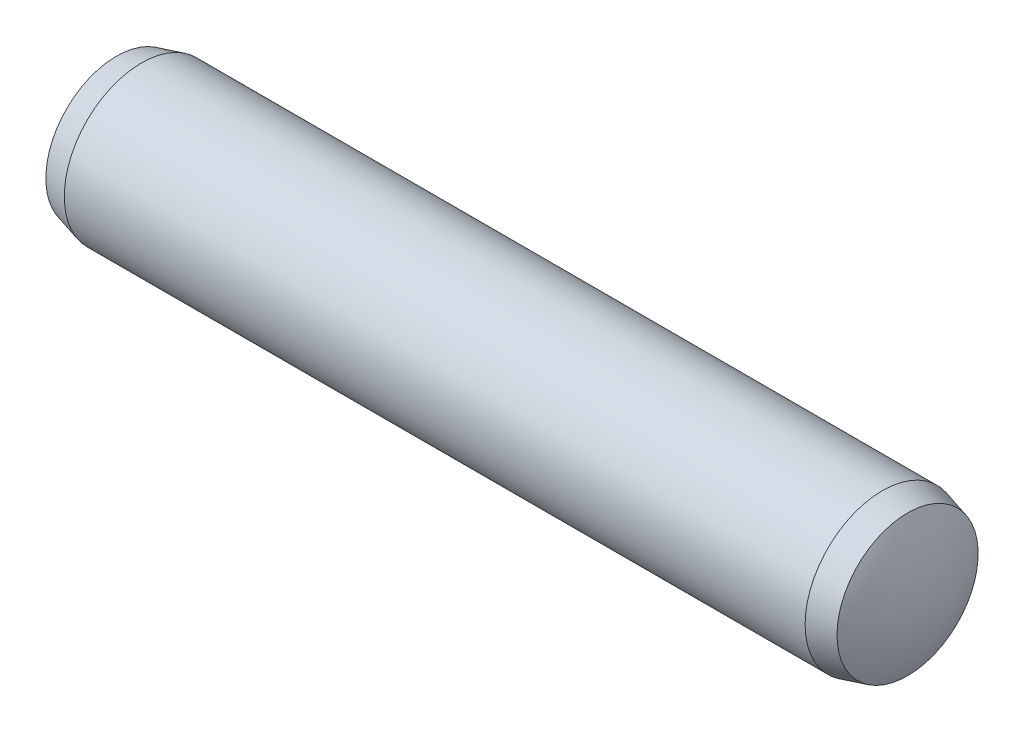
ISO-10303-21;
HEADER;
FILE_DESCRIPTION(('STEP AP214'),'2;1');
FILE_NAME('part.step','',(''),(''),'','','');
FILE_SCHEMA(('AUTOMOTIVE_DESIGN { 1 0 10303 214 1 1 1 1 }'));
ENDSEC;
DATA;
#1=APPLICATION_CONTEXT('core data for automotive mechanical design processes');
#2=APPLICATION_PROTOCOL_DEFINITION('international standard','automotive_design',2000,#1);
#3=PRODUCT_CONTEXT('',#1,'mechanical');
#4=PRODUCT('Part','Part','',(#3));
#5=PRODUCT_RELATED_PRODUCT_CATEGORY('part','',(#4));
#6=PRODUCT_DEFINITION_FORMATION('','',#4);
#7=PRODUCT_DEFINITION_CONTEXT('part definition',#1,'design');
#8=PRODUCT_DEFINITION('design','',#6,#7);
#9=PRODUCT_DEFINITION_SHAPE('','',#8);
#10=(LENGTH_UNIT() NAMED_UNIT(*) SI_UNIT(.MILLI.,.METRE.));
#11=(NAMED_UNIT(*) PLANE_ANGLE_UNIT() SI_UNIT($,.RADIAN.));
#12=(NAMED_UNIT(*) SI_UNIT($,.STERADIAN.) SOLID_ANGLE_UNIT());
#13=UNCERTAINTY_MEASURE_WITH_UNIT(LENGTH_MEASURE(1.E-05),#10,'distance_accuracy_value','');
#14=(GEOMETRIC_REPRESENTATION_CONTEXT(3) GLOBAL_UNCERTAINTY_ASSIGNED_CONTEXT((#13)) GLOBAL_UNIT_ASSIGNED_CONTEXT((#10,
#11,#12)) REPRESENTATION_CONTEXT('',''));
#15=CARTESIAN_POINT('',(0.,0.,0.));
#16=DIRECTION('',(0.,0.,1.));
#17=DIRECTION('',(1.,0.,0.));
#18=AXIS2_PLACEMENT_3D('',#15,#16,#17);
#19=CARTESIAN_POINT('',(-4.95259652750102,0.,0.));
#20=DIRECTION('',(0.,1.,0.));
#21=DIRECTION('',(-1.,0.,0.));
#22=AXIS2_PLACEMENT_3D('',#19,#20,#21);
#23=SPHERICAL_SURFACE('',#22,3.04740347249898);
#24=CARTESIAN_POINT('',(-7.67499999994925,0.,0.));
#25=DIRECTION('',(1.,0.,0.));
#26=DIRECTION('',(0.,0.,-1.));
#27=AXIS2_PLACEMENT_3D('',#24,#25,#26);
#28=CIRCLE('',#27,1.36937476867365);
#29=CARTESIAN_POINT('',(-7.67499999994925,0.,-1.36937476867365));
#30=VERTEX_POINT('',#29);
#31=EDGE_CURVE('E19',#30,#30,#28,.T.);
#32=ORIENTED_EDGE('',*,*,#31,.F.);
#33=EDGE_LOOP('',(#32));
#34=FACE_BOUND('',#33,.T.);
#35=ADVANCED_FACE('F15',(#34),#23,.T.);
#36=CARTESIAN_POINT('',(4.95259652750102,0.,0.));
#37=DIRECTION('',(0.,1.,0.));
#38=DIRECTION('',(1.,0.,0.));
#39=AXIS2_PLACEMENT_3D('',#36,#37,#38);
#40=SPHERICAL_SURFACE('',#39,3.04740347249898);
#41=CARTESIAN_POINT('',(7.67499999994925,0.,0.));
#42=DIRECTION('',(-1.,0.,0.));
#43=DIRECTION('',(0.,0.,1.));
#44=AXIS2_PLACEMENT_3D('',#41,#42,#43);
#45=CIRCLE('',#44,1.36937476867365);
#46=CARTESIAN_POINT('',(7.67499999994925,0.,1.36937476867365));
#47=VERTEX_POINT('',#46);
#48=EDGE_CURVE('E32',#47,#47,#45,.T.);
#49=ORIENTED_EDGE('',*,*,#48,.F.);
#50=EDGE_LOOP('',(#49));
#51=FACE_BOUND('',#50,.T.);
#52=ADVANCED_FACE('F37',(#51),#40,.T.);
#53=CARTESIAN_POINT('',(-7.18750000021373,0.,0.));
#54=DIRECTION('',(1.,0.,0.));
#55=DIRECTION('',(0.,0.,-1.));
#56=AXIS2_PLACEMENT_3D('',#53,#54,#55);
#57=CONICAL_SURFACE('',#56,1.49999999993611,0.26179938784347);
#58=ORIENTED_EDGE('',*,*,#31,.T.);
#59=EDGE_LOOP('',(#58));
#60=FACE_BOUND('',#59,.T.);
#61=CARTESIAN_POINT('',(-7.1875,0.,0.));
#62=DIRECTION('',(1.,0.,0.));
#63=DIRECTION('',(0.,0.,-1.));
#64=AXIS2_PLACEMENT_3D('',#61,#62,#63);
#65=CIRCLE('',#64,1.5);
#66=CARTESIAN_POINT('',(-7.1875,0.,-1.5));
#67=VERTEX_POINT('',#66);
#68=EDGE_CURVE('E24',#67,#67,#65,.T.);
#69=ORIENTED_EDGE('',*,*,#68,.F.);
#70=EDGE_LOOP('',(#69));
#71=FACE_BOUND('',#70,.T.);
#72=ADVANCED_FACE('F40',(#60,#71),#57,.T.);
#73=CARTESIAN_POINT('',(7.18750000021373,0.,0.));
#74=DIRECTION('',(-1.,0.,0.));
#75=DIRECTION('',(0.,0.,1.));
#76=AXIS2_PLACEMENT_3D('',#73,#74,#75);
#77=CONICAL_SURFACE('',#76,1.49999999993611,0.26179938784347);
#78=CARTESIAN_POINT('',(7.1875,0.,0.));
#79=DIRECTION('',(1.,0.,0.));
#80=DIRECTION('',(0.,0.,-1.));
#81=AXIS2_PLACEMENT_3D('',#78,#79,#80);
#82=CIRCLE('',#81,1.5);
#83=CARTESIAN_POINT('',(7.1875,0.,-1.5));
#84=VERTEX_POINT('',#83);
#85=EDGE_CURVE('E10',#84,#84,#82,.F.);
#86=ORIENTED_EDGE('',*,*,#85,.F.);
#87=EDGE_LOOP('',(#86));
#88=FACE_BOUND('',#87,.T.);
#89=ORIENTED_EDGE('',*,*,#48,.T.);
#90=EDGE_LOOP('',(#89));
#91=FACE_BOUND('',#90,.T.);
#92=ADVANCED_FACE('F44',(#88,#91),#77,.T.);
#93=CARTESIAN_POINT('',(-8.,0.,0.));
#94=DIRECTION('',(1.,0.,0.));
#95=DIRECTION('',(0.,0.,-1.));
#96=AXIS2_PLACEMENT_3D('',#93,#94,#95);
#97=CYLINDRICAL_SURFACE('',#96,1.5);
#98=ORIENTED_EDGE('',*,*,#85,.T.);
#99=EDGE_LOOP('',(#98));
#100=FACE_BOUND('',#99,.T.);
#101=ORIENTED_EDGE('',*,*,#68,.T.);
#102=EDGE_LOOP('',(#101));
#103=FACE_BOUND('',#102,.T.);
#104=ADVANCED_FACE('F48',(#100,#103),#97,.T.);
#105=CLOSED_SHELL('',(#35,#52,#72,#92,#104));
#106=MANIFOLD_SOLID_BREP('B1',#105);
#107=ADVANCED_BREP_SHAPE_REPRESENTATION('',(#18,#106),#14);
#108=SHAPE_DEFINITION_REPRESENTATION(#9,#107);
ENDSEC;
END-ISO-10303-21;
